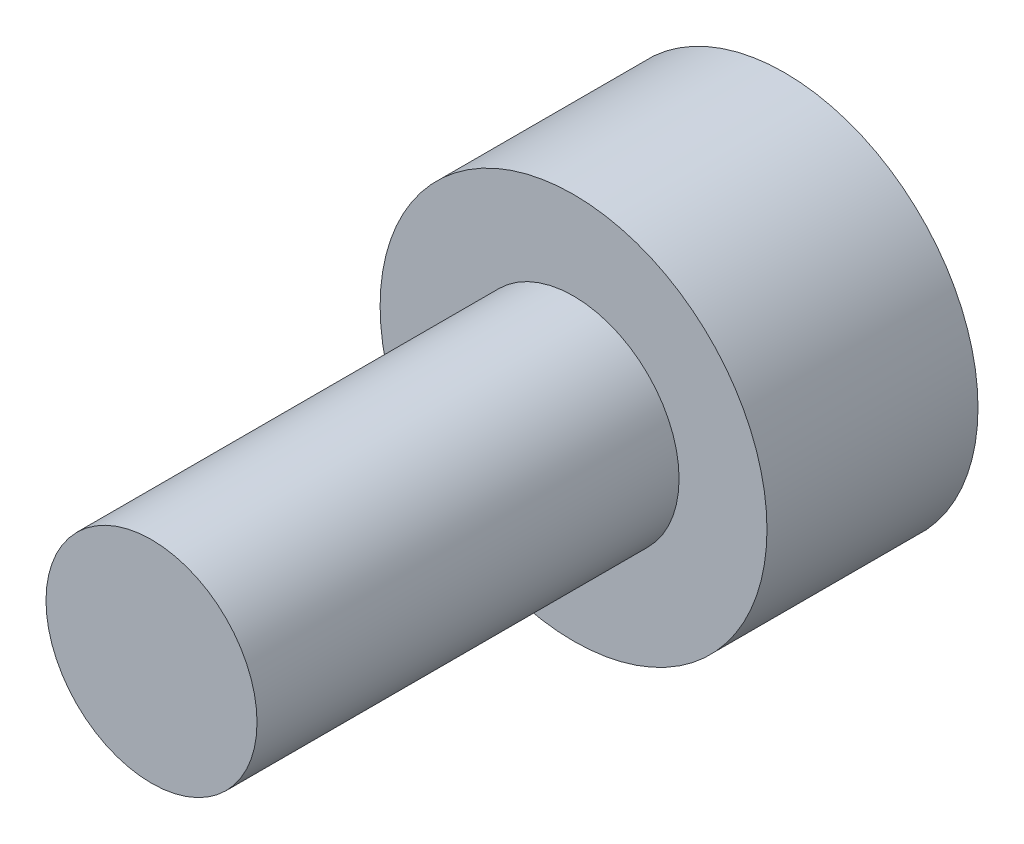
ISO-10303-21;
HEADER;
FILE_DESCRIPTION(('STEP AP214'),'2;1');
FILE_NAME('part.step','',(''),(''),'','','');
FILE_SCHEMA(('AUTOMOTIVE_DESIGN { 1 0 10303 214 1 1 1 1 }'));
ENDSEC;
DATA;
#1=APPLICATION_CONTEXT('core data for automotive mechanical design processes');
#2=APPLICATION_PROTOCOL_DEFINITION('international standard','automotive_design',2000,#1);
#3=PRODUCT_CONTEXT('',#1,'mechanical');
#4=PRODUCT('Part','Part','',(#3));
#5=PRODUCT_RELATED_PRODUCT_CATEGORY('part','',(#4));
#6=PRODUCT_DEFINITION_FORMATION('','',#4);
#7=PRODUCT_DEFINITION_CONTEXT('part definition',#1,'design');
#8=PRODUCT_DEFINITION('design','',#6,#7);
#9=PRODUCT_DEFINITION_SHAPE('','',#8);
#10=(LENGTH_UNIT() NAMED_UNIT(*) SI_UNIT(.MILLI.,.METRE.));
#11=(NAMED_UNIT(*) PLANE_ANGLE_UNIT() SI_UNIT($,.RADIAN.));
#12=(NAMED_UNIT(*) SI_UNIT($,.STERADIAN.) SOLID_ANGLE_UNIT());
#13=UNCERTAINTY_MEASURE_WITH_UNIT(LENGTH_MEASURE(1.E-05),#10,'distance_accuracy_value','');
#14=(GEOMETRIC_REPRESENTATION_CONTEXT(3) GLOBAL_UNCERTAINTY_ASSIGNED_CONTEXT((#13)) GLOBAL_UNIT_ASSIGNED_CONTEXT((#10,
#11,#12)) REPRESENTATION_CONTEXT('',''));
#15=CARTESIAN_POINT('',(0.,0.,0.));
#16=DIRECTION('',(0.,0.,1.));
#17=DIRECTION('',(1.,0.,0.));
#18=AXIS2_PLACEMENT_3D('',#15,#16,#17);
#19=CARTESIAN_POINT('',(0.,0.,-3.));
#20=DIRECTION('',(0.,0.,1.));
#21=DIRECTION('',(1.,0.,0.));
#22=AXIS2_PLACEMENT_3D('',#19,#20,#21);
#23=PLANE('',#22);
#24=CARTESIAN_POINT('',(0.,0.,-3.));
#25=DIRECTION('',(0.,0.,1.));
#26=DIRECTION('',(1.,0.,0.));
#27=AXIS2_PLACEMENT_3D('',#24,#25,#26);
#28=CIRCLE('',#27,2.75);
#29=CARTESIAN_POINT('',(2.75,0.,-3.));
#30=VERTEX_POINT('',#29);
#31=EDGE_CURVE('E47',#30,#30,#28,.T.);
#32=ORIENTED_EDGE('',*,*,#31,.F.);
#33=EDGE_LOOP('',(#32));
#34=FACE_BOUND('',#33,.T.);
#35=DIRECTION('',(0.5,0.866025403784439,0.));
#36=VECTOR('',#35,1.);
#37=CARTESIAN_POINT('',(0.721687836487032,-1.25,-3.));
#38=LINE('',#37,#36);
#39=CARTESIAN_POINT('',(0.721687836487032,-1.25,-3.));
#40=VERTEX_POINT('',#39);
#41=CARTESIAN_POINT('',(1.44337567297406,0.,-3.));
#42=VERTEX_POINT('',#41);
#43=EDGE_CURVE('E62',#40,#42,#38,.T.);
#44=ORIENTED_EDGE('',*,*,#43,.T.);
#45=DIRECTION('',(-0.5,0.866025403784439,0.));
#46=VECTOR('',#45,1.);
#47=CARTESIAN_POINT('',(1.44337567297406,0.,-3.));
#48=LINE('',#47,#46);
#49=CARTESIAN_POINT('',(0.721687836487032,1.25,-3.));
#50=VERTEX_POINT('',#49);
#51=EDGE_CURVE('E138',#42,#50,#48,.T.);
#52=ORIENTED_EDGE('',*,*,#51,.T.);
#53=DIRECTION('',(-1.,0.,0.));
#54=VECTOR('',#53,1.);
#55=CARTESIAN_POINT('',(0.721687836487032,1.25,-3.));
#56=LINE('',#55,#54);
#57=CARTESIAN_POINT('',(-0.721687836487032,1.25,-3.));
#58=VERTEX_POINT('',#57);
#59=EDGE_CURVE('E141',#50,#58,#56,.T.);
#60=ORIENTED_EDGE('',*,*,#59,.T.);
#61=DIRECTION('',(-0.5,-0.866025403784439,0.));
#62=VECTOR('',#61,1.);
#63=CARTESIAN_POINT('',(-0.721687836487032,1.25,-3.));
#64=LINE('',#63,#62);
#65=CARTESIAN_POINT('',(-1.44337567297406,0.,-3.));
#66=VERTEX_POINT('',#65);
#67=EDGE_CURVE('E150',#58,#66,#64,.T.);
#68=ORIENTED_EDGE('',*,*,#67,.T.);
#69=DIRECTION('',(0.5,-0.866025403784439,0.));
#70=VECTOR('',#69,1.);
#71=CARTESIAN_POINT('',(-1.44337567297406,0.,-3.));
#72=LINE('',#71,#70);
#73=CARTESIAN_POINT('',(-0.721687836487033,-1.25,-3.));
#74=VERTEX_POINT('',#73);
#75=EDGE_CURVE('E125',#66,#74,#72,.T.);
#76=ORIENTED_EDGE('',*,*,#75,.T.);
#77=DIRECTION('',(1.,0.,0.));
#78=VECTOR('',#77,1.);
#79=CARTESIAN_POINT('',(-0.721687836487033,-1.25,-3.));
#80=LINE('',#79,#78);
#81=EDGE_CURVE('E155',#74,#40,#80,.T.);
#82=ORIENTED_EDGE('',*,*,#81,.T.);
#83=EDGE_LOOP('',(#44,#52,#60,#68,#76,#82));
#84=FACE_BOUND('',#83,.T.);
#85=ADVANCED_FACE('F44',(#34,#84),#23,.F.);
#86=CARTESIAN_POINT('',(0.,0.,0.));
#87=DIRECTION('',(0.,0.,-1.));
#88=DIRECTION('',(-1.,0.,0.));
#89=AXIS2_PLACEMENT_3D('',#86,#87,#88);
#90=CYLINDRICAL_SURFACE('',#89,2.75);
#91=CARTESIAN_POINT('',(0.,0.,0.));
#92=DIRECTION('',(0.,0.,1.));
#93=DIRECTION('',(1.,0.,0.));
#94=AXIS2_PLACEMENT_3D('',#91,#92,#93);
#95=CIRCLE('',#94,2.75);
#96=CARTESIAN_POINT('',(2.75,0.,0.));
#97=VERTEX_POINT('',#96);
#98=EDGE_CURVE('E54',#97,#97,#95,.T.);
#99=ORIENTED_EDGE('',*,*,#98,.F.);
#100=EDGE_LOOP('',(#99));
#101=FACE_BOUND('',#100,.T.);
#102=ORIENTED_EDGE('',*,*,#31,.T.);
#103=EDGE_LOOP('',(#102));
#104=FACE_BOUND('',#103,.T.);
#105=ADVANCED_FACE('F50',(#101,#104),#90,.T.);
#106=CARTESIAN_POINT('',(0.,0.,0.));
#107=DIRECTION('',(0.,0.,1.));
#108=DIRECTION('',(1.,0.,0.));
#109=AXIS2_PLACEMENT_3D('',#106,#107,#108);
#110=PLANE('',#109);
#111=CARTESIAN_POINT('',(0.,0.,0.));
#112=DIRECTION('',(0.,0.,1.));
#113=DIRECTION('',(1.,0.,0.));
#114=AXIS2_PLACEMENT_3D('',#111,#112,#113);
#115=CIRCLE('',#114,1.5);
#116=CARTESIAN_POINT('',(1.5,0.,0.));
#117=VERTEX_POINT('',#116);
#118=EDGE_CURVE('E11',#117,#117,#115,.T.);
#119=ORIENTED_EDGE('',*,*,#118,.F.);
#120=EDGE_LOOP('',(#119));
#121=FACE_BOUND('',#120,.T.);
#122=ORIENTED_EDGE('',*,*,#98,.T.);
#123=EDGE_LOOP('',(#122));
#124=FACE_BOUND('',#123,.T.);
#125=ADVANCED_FACE('F212',(#121,#124),#110,.T.);
#126=CARTESIAN_POINT('',(0.,0.,6.));
#127=DIRECTION('',(0.,0.,-1.));
#128=DIRECTION('',(-1.,0.,0.));
#129=AXIS2_PLACEMENT_3D('',#126,#127,#128);
#130=CYLINDRICAL_SURFACE('',#129,1.5);
#131=CARTESIAN_POINT('',(0.,0.,6.));
#132=DIRECTION('',(0.,0.,1.));
#133=DIRECTION('',(1.,0.,0.));
#134=AXIS2_PLACEMENT_3D('',#131,#132,#133);
#135=CIRCLE('',#134,1.5);
#136=CARTESIAN_POINT('',(1.5,0.,6.));
#137=VERTEX_POINT('',#136);
#138=EDGE_CURVE('E166',#137,#137,#135,.T.);
#139=ORIENTED_EDGE('',*,*,#138,.F.);
#140=EDGE_LOOP('',(#139));
#141=FACE_BOUND('',#140,.T.);
#142=ORIENTED_EDGE('',*,*,#118,.T.);
#143=EDGE_LOOP('',(#142));
#144=FACE_BOUND('',#143,.T.);
#145=ADVANCED_FACE('F209',(#141,#144),#130,.T.);
#146=CARTESIAN_POINT('',(0.,0.,6.));
#147=DIRECTION('',(0.,0.,1.));
#148=DIRECTION('',(1.,0.,0.));
#149=AXIS2_PLACEMENT_3D('',#146,#147,#148);
#150=PLANE('',#149);
#151=ORIENTED_EDGE('',*,*,#138,.T.);
#152=EDGE_LOOP('',(#151));
#153=FACE_BOUND('',#152,.T.);
#154=ADVANCED_FACE('F204',(#153),#150,.T.);
#155=CARTESIAN_POINT('',(0.721687836487032,-1.25,-1.7));
#156=DIRECTION('',(-0.866025403784439,0.5,0.));
#157=DIRECTION('',(-0.5,-0.866025403784439,0.));
#158=AXIS2_PLACEMENT_3D('',#155,#156,#157);
#159=PLANE('',#158);
#160=ORIENTED_EDGE('',*,*,#43,.F.);
#161=DIRECTION('',(0.,0.,-1.));
#162=VECTOR('',#161,1.);
#163=CARTESIAN_POINT('',(0.721687836487032,-1.25,-1.7));
#164=LINE('',#163,#162);
#165=CARTESIAN_POINT('',(0.721687836487032,-1.25,-1.7));
#166=VERTEX_POINT('',#165);
#167=EDGE_CURVE('E132',#166,#40,#164,.T.);
#168=ORIENTED_EDGE('',*,*,#167,.F.);
#169=DIRECTION('',(0.5,0.866025403784439,0.));
#170=VECTOR('',#169,1.);
#171=CARTESIAN_POINT('',(0.721687836487032,-1.25,-1.7));
#172=LINE('',#171,#170);
#173=CARTESIAN_POINT('',(1.44337567297406,0.,-1.7));
#174=VERTEX_POINT('',#173);
#175=EDGE_CURVE('E156',#166,#174,#172,.T.);
#176=ORIENTED_EDGE('',*,*,#175,.T.);
#177=DIRECTION('',(0.,0.,-1.));
#178=VECTOR('',#177,1.);
#179=CARTESIAN_POINT('',(1.44337567297406,0.,-1.7));
#180=LINE('',#179,#178);
#181=EDGE_CURVE('E167',#174,#42,#180,.T.);
#182=ORIENTED_EDGE('',*,*,#181,.T.);
#183=EDGE_LOOP('',(#160,#168,#176,#182));
#184=FACE_BOUND('',#183,.T.);
#185=ADVANCED_FACE('F184',(#184),#159,.T.);
#186=CARTESIAN_POINT('',(1.44337567297406,0.,-1.7));
#187=DIRECTION('',(-0.866025403784439,-0.5,0.));
#188=DIRECTION('',(0.5,-0.866025403784439,0.));
#189=AXIS2_PLACEMENT_3D('',#186,#187,#188);
#190=PLANE('',#189);
#191=ORIENTED_EDGE('',*,*,#51,.F.);
#192=ORIENTED_EDGE('',*,*,#181,.F.);
#193=DIRECTION('',(-0.5,0.866025403784439,0.));
#194=VECTOR('',#193,1.);
#195=CARTESIAN_POINT('',(1.44337567297406,0.,-1.7));
#196=LINE('',#195,#194);
#197=CARTESIAN_POINT('',(0.721687836487032,1.25,-1.7));
#198=VERTEX_POINT('',#197);
#199=EDGE_CURVE('E105',#174,#198,#196,.T.);
#200=ORIENTED_EDGE('',*,*,#199,.T.);
#201=DIRECTION('',(0.,0.,-1.));
#202=VECTOR('',#201,1.);
#203=CARTESIAN_POINT('',(0.721687836487032,1.25,-1.7));
#204=LINE('',#203,#202);
#205=EDGE_CURVE('E162',#198,#50,#204,.T.);
#206=ORIENTED_EDGE('',*,*,#205,.T.);
#207=EDGE_LOOP('',(#191,#192,#200,#206));
#208=FACE_BOUND('',#207,.T.);
#209=ADVANCED_FACE('F198',(#208),#190,.T.);
#210=CARTESIAN_POINT('',(0.721687836487032,1.25,-1.7));
#211=DIRECTION('',(0.,-1.,0.));
#212=DIRECTION('',(1.,0.,0.));
#213=AXIS2_PLACEMENT_3D('',#210,#211,#212);
#214=PLANE('',#213);
#215=ORIENTED_EDGE('',*,*,#59,.F.);
#216=ORIENTED_EDGE('',*,*,#205,.F.);
#217=DIRECTION('',(-1.,0.,0.));
#218=VECTOR('',#217,1.);
#219=CARTESIAN_POINT('',(0.721687836487032,1.25,-1.7));
#220=LINE('',#219,#218);
#221=CARTESIAN_POINT('',(-0.721687836487032,1.25,-1.7));
#222=VERTEX_POINT('',#221);
#223=EDGE_CURVE('E121',#198,#222,#220,.T.);
#224=ORIENTED_EDGE('',*,*,#223,.T.);
#225=DIRECTION('',(0.,0.,-1.));
#226=VECTOR('',#225,1.);
#227=CARTESIAN_POINT('',(-0.721687836487032,1.25,-1.7));
#228=LINE('',#227,#226);
#229=EDGE_CURVE('E119',#222,#58,#228,.T.);
#230=ORIENTED_EDGE('',*,*,#229,.T.);
#231=EDGE_LOOP('',(#215,#216,#224,#230));
#232=FACE_BOUND('',#231,.T.);
#233=ADVANCED_FACE('F193',(#232),#214,.T.);
#234=CARTESIAN_POINT('',(-0.721687836487032,1.25,-1.7));
#235=DIRECTION('',(0.866025403784439,-0.5,0.));
#236=DIRECTION('',(0.5,0.866025403784439,0.));
#237=AXIS2_PLACEMENT_3D('',#234,#235,#236);
#238=PLANE('',#237);
#239=ORIENTED_EDGE('',*,*,#67,.F.);
#240=ORIENTED_EDGE('',*,*,#229,.F.);
#241=DIRECTION('',(-0.5,-0.866025403784439,0.));
#242=VECTOR('',#241,1.);
#243=CARTESIAN_POINT('',(-0.721687836487032,1.25,-1.7));
#244=LINE('',#243,#242);
#245=CARTESIAN_POINT('',(-1.44337567297406,0.,-1.7));
#246=VERTEX_POINT('',#245);
#247=EDGE_CURVE('E115',#222,#246,#244,.T.);
#248=ORIENTED_EDGE('',*,*,#247,.T.);
#249=DIRECTION('',(0.,0.,-1.));
#250=VECTOR('',#249,1.);
#251=CARTESIAN_POINT('',(-1.44337567297406,0.,-1.7));
#252=LINE('',#251,#250);
#253=EDGE_CURVE('E118',#246,#66,#252,.T.);
#254=ORIENTED_EDGE('',*,*,#253,.T.);
#255=EDGE_LOOP('',(#239,#240,#248,#254));
#256=FACE_BOUND('',#255,.T.);
#257=ADVANCED_FACE('F113',(#256),#238,.T.);
#258=CARTESIAN_POINT('',(-1.44337567297406,0.,-1.7));
#259=DIRECTION('',(0.866025403784439,0.5,0.));
#260=DIRECTION('',(-0.5,0.866025403784439,0.));
#261=AXIS2_PLACEMENT_3D('',#258,#259,#260);
#262=PLANE('',#261);
#263=ORIENTED_EDGE('',*,*,#75,.F.);
#264=ORIENTED_EDGE('',*,*,#253,.F.);
#265=DIRECTION('',(0.5,-0.866025403784439,0.));
#266=VECTOR('',#265,1.);
#267=CARTESIAN_POINT('',(-1.44337567297406,0.,-1.7));
#268=LINE('',#267,#266);
#269=CARTESIAN_POINT('',(-0.721687836487033,-1.25,-1.7));
#270=VERTEX_POINT('',#269);
#271=EDGE_CURVE('E116',#246,#270,#268,.T.);
#272=ORIENTED_EDGE('',*,*,#271,.T.);
#273=DIRECTION('',(0.,0.,-1.));
#274=VECTOR('',#273,1.);
#275=CARTESIAN_POINT('',(-0.721687836487033,-1.25,-1.7));
#276=LINE('',#275,#274);
#277=EDGE_CURVE('E91',#270,#74,#276,.T.);
#278=ORIENTED_EDGE('',*,*,#277,.T.);
#279=EDGE_LOOP('',(#263,#264,#272,#278));
#280=FACE_BOUND('',#279,.T.);
#281=ADVANCED_FACE('F124',(#280),#262,.T.);
#282=CARTESIAN_POINT('',(-0.721687836487033,-1.25,-1.7));
#283=DIRECTION('',(0.,1.,0.));
#284=DIRECTION('',(-1.,0.,0.));
#285=AXIS2_PLACEMENT_3D('',#282,#283,#284);
#286=PLANE('',#285);
#287=ORIENTED_EDGE('',*,*,#81,.F.);
#288=ORIENTED_EDGE('',*,*,#277,.F.);
#289=DIRECTION('',(1.,0.,0.));
#290=VECTOR('',#289,1.);
#291=CARTESIAN_POINT('',(-0.721687836487033,-1.25,-1.7));
#292=LINE('',#291,#290);
#293=EDGE_CURVE('E72',#270,#166,#292,.T.);
#294=ORIENTED_EDGE('',*,*,#293,.T.);
#295=ORIENTED_EDGE('',*,*,#167,.T.);
#296=EDGE_LOOP('',(#287,#288,#294,#295));
#297=FACE_BOUND('',#296,.T.);
#298=ADVANCED_FACE('F181',(#297),#286,.T.);
#299=CARTESIAN_POINT('',(0.,0.,-1.7));
#300=DIRECTION('',(0.,0.,1.));
#301=DIRECTION('',(1.,0.,0.));
#302=AXIS2_PLACEMENT_3D('',#299,#300,#301);
#303=PLANE('',#302);
#304=ORIENTED_EDGE('',*,*,#175,.F.);
#305=ORIENTED_EDGE('',*,*,#293,.F.);
#306=ORIENTED_EDGE('',*,*,#271,.F.);
#307=ORIENTED_EDGE('',*,*,#247,.F.);
#308=ORIENTED_EDGE('',*,*,#223,.F.);
#309=ORIENTED_EDGE('',*,*,#199,.F.);
#310=EDGE_LOOP('',(#304,#305,#306,#307,#308,#309));
#311=FACE_BOUND('',#310,.T.);
#312=ADVANCED_FACE('F129',(#311),#303,.F.);
#313=CLOSED_SHELL('',(#85,#105,#125,#145,#154,#185,#209,#233,#257,#281,#298,#312));
#314=MANIFOLD_SOLID_BREP('B2',#313);
#315=ADVANCED_BREP_SHAPE_REPRESENTATION('',(#18,#314),#14);
#316=SHAPE_DEFINITION_REPRESENTATION(#9,#315);
ENDSEC;
END-ISO-10303-21;
